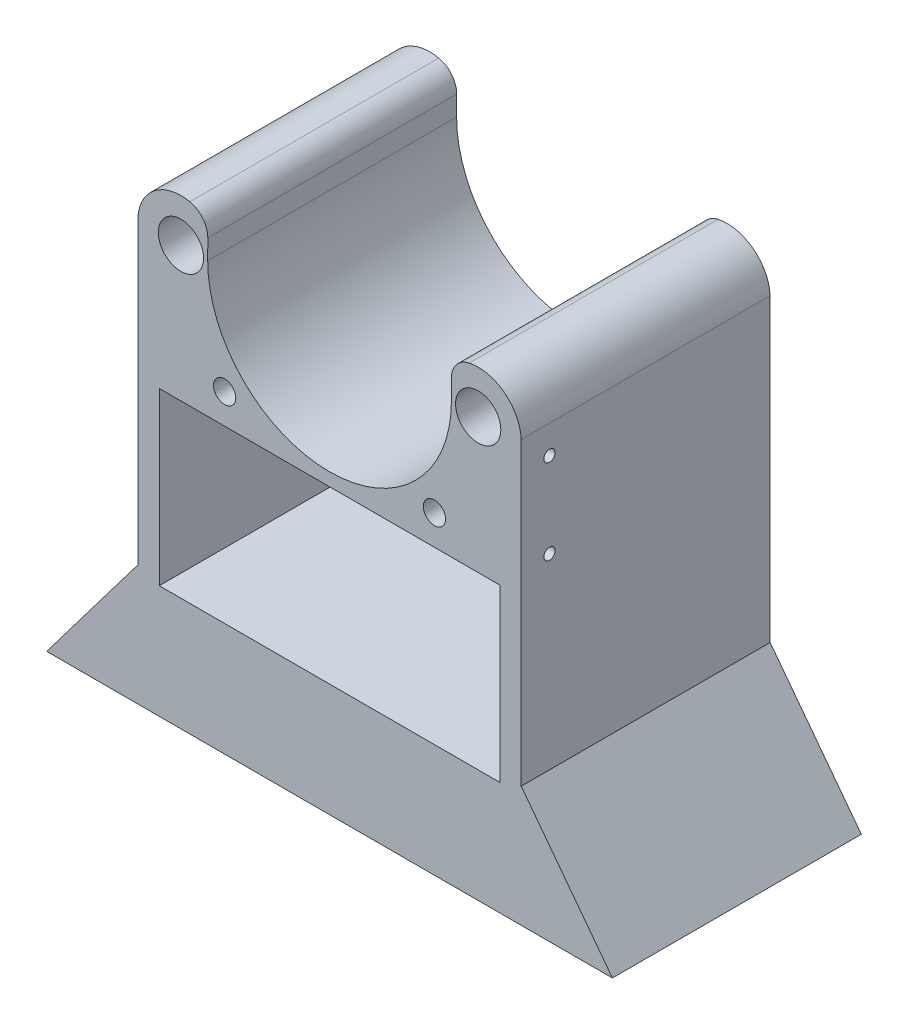
ISO-10303-21;
HEADER;
FILE_DESCRIPTION(('STEP AP214'),'2;1');
FILE_NAME('part.step','',(''),(''),'','','');
FILE_SCHEMA(('AUTOMOTIVE_DESIGN { 1 0 10303 214 1 1 1 1 }'));
ENDSEC;
DATA;
#1=APPLICATION_CONTEXT('core data for automotive mechanical design processes');
#2=APPLICATION_PROTOCOL_DEFINITION('international standard','automotive_design',2000,#1);
#3=PRODUCT_CONTEXT('',#1,'mechanical');
#4=PRODUCT('Part','Part','',(#3));
#5=PRODUCT_RELATED_PRODUCT_CATEGORY('part','',(#4));
#6=PRODUCT_DEFINITION_FORMATION('','',#4);
#7=PRODUCT_DEFINITION_CONTEXT('part definition',#1,'design');
#8=PRODUCT_DEFINITION('design','',#6,#7);
#9=PRODUCT_DEFINITION_SHAPE('','',#8);
#10=(LENGTH_UNIT() NAMED_UNIT(*) SI_UNIT(.MILLI.,.METRE.));
#11=(NAMED_UNIT(*) PLANE_ANGLE_UNIT() SI_UNIT($,.RADIAN.));
#12=(NAMED_UNIT(*) SI_UNIT($,.STERADIAN.) SOLID_ANGLE_UNIT());
#13=UNCERTAINTY_MEASURE_WITH_UNIT(LENGTH_MEASURE(1.E-05),#10,'distance_accuracy_value','');
#14=(GEOMETRIC_REPRESENTATION_CONTEXT(3) GLOBAL_UNCERTAINTY_ASSIGNED_CONTEXT((#13)) GLOBAL_UNIT_ASSIGNED_CONTEXT((#10,
#11,#12)) REPRESENTATION_CONTEXT('',''));
#15=CARTESIAN_POINT('',(0.,0.,0.));
#16=DIRECTION('',(0.,0.,1.));
#17=DIRECTION('',(1.,0.,0.));
#18=AXIS2_PLACEMENT_3D('',#15,#16,#17);
#19=CARTESIAN_POINT('',(43.029964919441,19.177,50.8));
#20=DIRECTION('',(-1.,0.,0.));
#21=DIRECTION('',(0.,0.,1.));
#22=AXIS2_PLACEMENT_3D('',#19,#20,#21);
#23=PLANE('',#22);
#24=CARTESIAN_POINT('',(43.029964919441,43.5410976898226,44.45));
#25=DIRECTION('',(-1.,0.,0.));
#26=DIRECTION('',(0.,0.,1.));
#27=AXIS2_PLACEMENT_3D('',#24,#25,#26);
#28=CIRCLE('',#27,1.27);
#29=CARTESIAN_POINT('',(43.029964919441,43.5410976898226,45.72));
#30=VERTEX_POINT('',#29);
#31=EDGE_CURVE('E755',#30,#30,#28,.T.);
#32=ORIENTED_EDGE('',*,*,#31,.T.);
#33=EDGE_LOOP('',(#32));
#34=FACE_BOUND('',#33,.T.);
#35=DIRECTION('',(0.,0.,-1.));
#36=VECTOR('',#35,1.);
#37=CARTESIAN_POINT('',(43.029964919441,-17.5223314583823,50.8));
#38=LINE('',#37,#36);
#39=CARTESIAN_POINT('',(43.029964919441,-17.5223314583823,50.8));
#40=VERTEX_POINT('',#39);
#41=CARTESIAN_POINT('',(43.029964919441,-17.5223314583823,-5.08));
#42=VERTEX_POINT('',#41);
#43=EDGE_CURVE('E167',#40,#42,#38,.T.);
#44=ORIENTED_EDGE('',*,*,#43,.T.);
#45=DIRECTION('',(0.,-1.,0.));
#46=VECTOR('',#45,1.);
#47=CARTESIAN_POINT('',(43.029964919441,49.8910976898227,-5.08));
#48=LINE('',#47,#46);
#49=CARTESIAN_POINT('',(43.029964919441,49.8910976898225,-5.08));
#50=VERTEX_POINT('',#49);
#51=EDGE_CURVE('E151',#50,#42,#48,.T.);
#52=ORIENTED_EDGE('',*,*,#51,.F.);
#53=DIRECTION('',(0.,0.,-1.));
#54=VECTOR('',#53,1.);
#55=CARTESIAN_POINT('',(43.029964919441,49.8910976898227,50.8));
#56=LINE('',#55,#54);
#57=CARTESIAN_POINT('',(43.029964919441,49.8910976898227,50.8));
#58=VERTEX_POINT('',#57);
#59=EDGE_CURVE('E161',#58,#50,#56,.T.);
#60=ORIENTED_EDGE('',*,*,#59,.F.);
#61=DIRECTION('',(0.,1.,0.));
#62=VECTOR('',#61,1.);
#63=CARTESIAN_POINT('',(43.029964919441,-17.5223314583823,50.8));
#64=LINE('',#63,#62);
#65=EDGE_CURVE('E227',#40,#58,#64,.T.);
#66=ORIENTED_EDGE('',*,*,#65,.F.);
#67=EDGE_LOOP('',(#44,#52,#60,#66));
#68=FACE_BOUND('',#67,.T.);
#69=CARTESIAN_POINT('',(43.029964919441,24.4910976898226,44.45));
#70=DIRECTION('',(-1.,0.,0.));
#71=DIRECTION('',(0.,0.,1.));
#72=AXIS2_PLACEMENT_3D('',#69,#70,#71);
#73=CIRCLE('',#72,1.27);
#74=CARTESIAN_POINT('',(43.029964919441,24.4910976898226,45.72));
#75=VERTEX_POINT('',#74);
#76=EDGE_CURVE('E753',#75,#75,#73,.T.);
#77=ORIENTED_EDGE('',*,*,#76,.T.);
#78=EDGE_LOOP('',(#77));
#79=FACE_BOUND('',#78,.T.);
#80=ADVANCED_FACE('F33',(#34,#68,#79),#23,.F.);
#81=CARTESIAN_POINT('',(33.3647511090705,49.8910976898227,-5.08));
#82=DIRECTION('',(0.,0.,1.));
#83=DIRECTION('',(1.,0.,0.));
#84=AXIS2_PLACEMENT_3D('',#81,#82,#83);
#85=PLANE('',#84);
#86=CARTESIAN_POINT('',(23.55,25.889500054,-5.08));
#87=DIRECTION('',(0.,0.,-1.));
#88=DIRECTION('',(-1.,0.,0.));
#89=AXIS2_PLACEMENT_3D('',#86,#87,#88);
#90=CIRCLE('',#89,2.5);
#91=CARTESIAN_POINT('',(21.05,25.889500054,-5.08));
#92=VERTEX_POINT('',#91);
#93=EDGE_CURVE('E178',#92,#92,#90,.T.);
#94=ORIENTED_EDGE('',*,*,#93,.F.);
#95=EDGE_LOOP('',(#94));
#96=FACE_BOUND('',#95,.T.);
#97=CARTESIAN_POINT('',(-23.55,25.889500054,-5.08));
#98=DIRECTION('',(0.,0.,-1.));
#99=DIRECTION('',(-1.,0.,0.));
#100=AXIS2_PLACEMENT_3D('',#97,#98,#99);
#101=CIRCLE('',#100,2.5);
#102=CARTESIAN_POINT('',(-26.05,25.889500054,-5.08));
#103=VERTEX_POINT('',#102);
#104=EDGE_CURVE('E319',#103,#103,#101,.T.);
#105=ORIENTED_EDGE('',*,*,#104,.F.);
#106=EDGE_LOOP('',(#105));
#107=FACE_BOUND('',#106,.T.);
#108=CARTESIAN_POINT('',(18.8760964149553,0.173903585044877,-5.08));
#109=DIRECTION('',(0.,0.,1.));
#110=DIRECTION('',(1.,0.,0.));
#111=AXIS2_PLACEMENT_3D('',#108,#109,#110);
#112=CIRCLE('',#111,3.3274);
#113=CARTESIAN_POINT('',(22.2034964149553,0.173903585044877,-5.08));
#114=VERTEX_POINT('',#113);
#115=EDGE_CURVE('E316',#114,#114,#112,.T.);
#116=ORIENTED_EDGE('',*,*,#115,.T.);
#117=EDGE_LOOP('',(#116));
#118=FACE_BOUND('',#117,.T.);
#119=CARTESIAN_POINT('',(-19.2239035850447,0.173903585044877,-5.08));
#120=DIRECTION('',(0.,0.,1.));
#121=DIRECTION('',(1.,0.,0.));
#122=AXIS2_PLACEMENT_3D('',#119,#120,#121);
#123=CIRCLE('',#122,3.3274);
#124=CARTESIAN_POINT('',(-15.8965035850447,0.173903585044877,-5.08));
#125=VERTEX_POINT('',#124);
#126=EDGE_CURVE('E310',#125,#125,#123,.T.);
#127=ORIENTED_EDGE('',*,*,#126,.T.);
#128=EDGE_LOOP('',(#127));
#129=FACE_BOUND('',#128,.T.);
#130=DIRECTION('',(-0.004485046887855,0.999989942126626,0.));
#131=VECTOR('',#130,1.);
#132=CARTESIAN_POINT('',(27.5715608985518,0.123660987167873,-5.07999999999997));
#133=LINE('',#132,#131);
#134=CARTESIAN_POINT('',(27.3503748233617,49.439500054,-5.07999999999997));
#135=VERTEX_POINT('',#134);
#136=CARTESIAN_POINT('',(27.3303126799442,53.9125729418832,-5.07999999999997));
#137=VERTEX_POINT('',#136);
#138=EDGE_CURVE('E262',#135,#137,#133,.T.);
#139=ORIENTED_EDGE('',*,*,#138,.T.);
#140=CARTESIAN_POINT('',(32.4102615859475,53.9353569800736,-5.08));
#141=DIRECTION('',(0.,0.,1.));
#142=DIRECTION('',(1.,0.,0.));
#143=AXIS2_PLACEMENT_3D('',#140,#141,#142);
#144=CIRCLE('',#143,5.08);
#145=CARTESIAN_POINT('',(31.3555354783079,58.9046580212526,-5.08));
#146=VERTEX_POINT('',#145);
#147=EDGE_CURVE('E153',#137,#146,#144,.F.);
#148=ORIENTED_EDGE('',*,*,#147,.T.);
#149=CARTESIAN_POINT('',(33.364499946,49.439500054,-5.08));
#150=DIRECTION('',(0.,0.,1.));
#151=DIRECTION('',(1.,0.,0.));
#152=AXIS2_PLACEMENT_3D('',#149,#150,#151);
#153=CIRCLE('',#152,9.67600917617876);
#154=EDGE_CURVE('E145',#146,#50,#153,.F.);
#155=ORIENTED_EDGE('',*,*,#154,.T.);
#156=ORIENTED_EDGE('',*,*,#51,.T.);
#157=DIRECTION('',(0.603372043697109,-0.797459827756091,0.));
#158=VECTOR('',#157,1.);
#159=CARTESIAN_POINT('',(43.029964919441,-17.5223314583823,-5.08));
#160=LINE('',#159,#158);
#161=CARTESIAN_POINT('',(63.5,-44.577,-5.08));
#162=VERTEX_POINT('',#161);
#163=EDGE_CURVE('E172',#42,#162,#160,.T.);
#164=ORIENTED_EDGE('',*,*,#163,.T.);
#165=DIRECTION('',(-1.,0.,0.));
#166=VECTOR('',#165,1.);
#167=CARTESIAN_POINT('',(63.5,-44.577,-5.08));
#168=LINE('',#167,#166);
#169=CARTESIAN_POINT('',(-63.5,-44.577,-5.08));
#170=VERTEX_POINT('',#169);
#171=EDGE_CURVE('E175',#162,#170,#168,.T.);
#172=ORIENTED_EDGE('',*,*,#171,.T.);
#173=DIRECTION('',(0.603372043697109,0.797459827756091,0.));
#174=VECTOR('',#173,1.);
#175=CARTESIAN_POINT('',(-63.5,-44.577,-5.08));
#176=LINE('',#175,#174);
#177=CARTESIAN_POINT('',(-43.029964919441,-17.5223314583823,-5.08));
#178=VERTEX_POINT('',#177);
#179=EDGE_CURVE('E184',#170,#178,#176,.T.);
#180=ORIENTED_EDGE('',*,*,#179,.T.);
#181=DIRECTION('',(0.,1.,0.));
#182=VECTOR('',#181,1.);
#183=CARTESIAN_POINT('',(-43.029964919441,-17.5223314583823,-5.08));
#184=LINE('',#183,#182);
#185=CARTESIAN_POINT('',(-43.029964919441,49.8910976898225,-5.08));
#186=VERTEX_POINT('',#185);
#187=EDGE_CURVE('E187',#178,#186,#184,.T.);
#188=ORIENTED_EDGE('',*,*,#187,.T.);
#189=CARTESIAN_POINT('',(-33.364499946,49.439500054,-5.08));
#190=DIRECTION('',(0.,0.,1.));
#191=DIRECTION('',(1.,0.,0.));
#192=AXIS2_PLACEMENT_3D('',#189,#190,#191);
#193=CIRCLE('',#192,9.67600917617876);
#194=CARTESIAN_POINT('',(-31.3555354783078,58.9046580212526,-5.08));
#195=VERTEX_POINT('',#194);
#196=EDGE_CURVE('E156',#195,#186,#193,.T.);
#197=ORIENTED_EDGE('',*,*,#196,.F.);
#198=CARTESIAN_POINT('',(-32.4102615859474,53.9353569800736,-5.08));
#199=DIRECTION('',(0.,0.,1.));
#200=DIRECTION('',(1.,0.,0.));
#201=AXIS2_PLACEMENT_3D('',#198,#199,#200);
#202=CIRCLE('',#201,5.08);
#203=CARTESIAN_POINT('',(-27.3303126799442,53.9125729418832,-5.07999999999997));
#204=VERTEX_POINT('',#203);
#205=EDGE_CURVE('E246',#195,#204,#202,.F.);
#206=ORIENTED_EDGE('',*,*,#205,.T.);
#207=DIRECTION('',(0.00448504688785946,0.999989942126626,0.));
#208=VECTOR('',#207,1.);
#209=CARTESIAN_POINT('',(-27.5715608985521,0.123660987167984,-5.07999999999997));
#210=LINE('',#209,#208);
#211=CARTESIAN_POINT('',(-27.3503748233617,49.439500054,-5.07999999999997));
#212=VERTEX_POINT('',#211);
#213=EDGE_CURVE('E269',#212,#204,#210,.T.);
#214=ORIENTED_EDGE('',*,*,#213,.F.);
#215=CARTESIAN_POINT('',(0.,49.439500054,-5.07999999999997));
#216=DIRECTION('',(0.,0.,-1.));
#217=DIRECTION('',(-1.,0.,0.));
#218=AXIS2_PLACEMENT_3D('',#215,#216,#217);
#219=CIRCLE('',#218,27.3503748233617);
#220=EDGE_CURVE('E264',#135,#212,#219,.T.);
#221=ORIENTED_EDGE('',*,*,#220,.F.);
#222=EDGE_LOOP('',(#139,#148,#155,#156,#164,#172,#180,#188,#197,#206,#214,#221));
#223=FACE_BOUND('',#222,.T.);
#224=ADVANCED_FACE('F148',(#96,#107,#118,#129,#223),#85,.F.);
#225=CARTESIAN_POINT('',(-27.5715608985521,0.123660987167984,55.118));
#226=DIRECTION('',(-0.999989942126626,0.00448504688785946,0.));
#227=DIRECTION('',(-0.00448504688785946,-0.999989942126626,0.));
#228=AXIS2_PLACEMENT_3D('',#225,#226,#227);
#229=PLANE('',#228);
#230=ORIENTED_EDGE('',*,*,#213,.T.);
#231=DIRECTION('',(0.,0.,-1.));
#232=VECTOR('',#231,1.);
#233=CARTESIAN_POINT('',(-27.3303126799442,53.9125729418832,55.118));
#234=LINE('',#233,#232);
#235=CARTESIAN_POINT('',(-27.3303126799442,53.9125729418832,50.8));
#236=VERTEX_POINT('',#235);
#237=EDGE_CURVE('E11',#204,#236,#234,.F.);
#238=ORIENTED_EDGE('',*,*,#237,.T.);
#239=DIRECTION('',(-0.00448504688785946,-0.999989942126626,0.));
#240=VECTOR('',#239,1.);
#241=CARTESIAN_POINT('',(-27.349153504459,49.7118063752811,50.8));
#242=LINE('',#241,#240);
#243=CARTESIAN_POINT('',(-27.3503748233617,49.439500054,50.8));
#244=VERTEX_POINT('',#243);
#245=EDGE_CURVE('E275',#236,#244,#242,.T.);
#246=ORIENTED_EDGE('',*,*,#245,.T.);
#247=DIRECTION('',(0.,0.,-1.));
#248=VECTOR('',#247,1.);
#249=CARTESIAN_POINT('',(-27.3503748233617,49.439500054,55.118));
#250=LINE('',#249,#248);
#251=EDGE_CURVE('E272',#244,#212,#250,.T.);
#252=ORIENTED_EDGE('',*,*,#251,.T.);
#253=EDGE_LOOP('',(#230,#238,#246,#252));
#254=FACE_BOUND('',#253,.T.);
#255=ADVANCED_FACE('F331',(#254),#229,.F.);
#256=CARTESIAN_POINT('',(33.364499946,49.439500054,50.8));
#257=DIRECTION('',(0.,0.,-1.));
#258=DIRECTION('',(-1.,0.,0.));
#259=AXIS2_PLACEMENT_3D('',#256,#257,#258);
#260=CYLINDRICAL_SURFACE('',#259,9.67600917617876);
#261=ORIENTED_EDGE('',*,*,#154,.F.);
#262=DIRECTION('',(0.,0.,-1.));
#263=VECTOR('',#262,1.);
#264=CARTESIAN_POINT('',(31.3555354783079,58.9046580212526,50.8));
#265=LINE('',#264,#263);
#266=CARTESIAN_POINT('',(31.3555354783079,58.9046580212526,50.8));
#267=VERTEX_POINT('',#266);
#268=EDGE_CURVE('E249',#146,#267,#265,.F.);
#269=ORIENTED_EDGE('',*,*,#268,.T.);
#270=CARTESIAN_POINT('',(33.364499946,49.439500054,50.8));
#271=DIRECTION('',(0.,0.,1.));
#272=DIRECTION('',(1.,0.,0.));
#273=AXIS2_PLACEMENT_3D('',#270,#271,#272);
#274=CIRCLE('',#273,9.67600917617876);
#275=EDGE_CURVE('E164',#58,#267,#274,.T.);
#276=ORIENTED_EDGE('',*,*,#275,.F.);
#277=ORIENTED_EDGE('',*,*,#59,.T.);
#278=EDGE_LOOP('',(#261,#269,#276,#277));
#279=FACE_BOUND('',#278,.T.);
#280=ADVANCED_FACE('F162',(#279),#260,.T.);
#281=CARTESIAN_POINT('',(33.364499946,49.439500054,50.8));
#282=DIRECTION('',(0.,0.,1.));
#283=DIRECTION('',(1.,0.,0.));
#284=AXIS2_PLACEMENT_3D('',#281,#282,#283);
#285=PLANE('',#284);
#286=ORIENTED_EDGE('',*,*,#275,.T.);
#287=CARTESIAN_POINT('',(32.4102615859475,53.9353569800736,50.8));
#288=DIRECTION('',(0.,0.,1.));
#289=DIRECTION('',(1.,0.,0.));
#290=AXIS2_PLACEMENT_3D('',#287,#288,#289);
#291=CIRCLE('',#290,5.08);
#292=CARTESIAN_POINT('',(27.3303126799442,53.9125729418833,50.8));
#293=VERTEX_POINT('',#292);
#294=EDGE_CURVE('E252',#267,#293,#291,.T.);
#295=ORIENTED_EDGE('',*,*,#294,.T.);
#296=DIRECTION('',(0.004485046887855,-0.999989942126627,0.));
#297=VECTOR('',#296,1.);
#298=CARTESIAN_POINT('',(27.3504958013711,49.4125266921329,50.8));
#299=LINE('',#298,#297);
#300=CARTESIAN_POINT('',(27.3503748233617,49.439500054,50.8));
#301=VERTEX_POINT('',#300);
#302=EDGE_CURVE('E278',#293,#301,#299,.T.);
#303=ORIENTED_EDGE('',*,*,#302,.T.);
#304=CARTESIAN_POINT('',(0.,49.439500054,50.8));
#305=DIRECTION('',(0.,0.,1.));
#306=DIRECTION('',(1.,0.,0.));
#307=AXIS2_PLACEMENT_3D('',#304,#305,#306);
#308=CIRCLE('',#307,27.3503748233617);
#309=EDGE_CURVE('E280',#244,#301,#308,.T.);
#310=ORIENTED_EDGE('',*,*,#309,.F.);
#311=ORIENTED_EDGE('',*,*,#245,.F.);
#312=CARTESIAN_POINT('',(-32.4102615859474,53.9353569800736,50.8));
#313=DIRECTION('',(0.,0.,1.));
#314=DIRECTION('',(1.,0.,0.));
#315=AXIS2_PLACEMENT_3D('',#312,#313,#314);
#316=CIRCLE('',#315,5.08);
#317=CARTESIAN_POINT('',(-31.3555354783078,58.9046580212526,50.8));
#318=VERTEX_POINT('',#317);
#319=EDGE_CURVE('E48',#236,#318,#316,.T.);
#320=ORIENTED_EDGE('',*,*,#319,.T.);
#321=CARTESIAN_POINT('',(-33.364499946,49.439500054,50.8));
#322=DIRECTION('',(0.,0.,1.));
#323=DIRECTION('',(-1.,0.,0.));
#324=AXIS2_PLACEMENT_3D('',#321,#322,#323);
#325=CIRCLE('',#324,9.67600917617876);
#326=CARTESIAN_POINT('',(-43.029964919441,49.8910976898227,50.8));
#327=VERTEX_POINT('',#326);
#328=EDGE_CURVE('E230',#318,#327,#325,.T.);
#329=ORIENTED_EDGE('',*,*,#328,.T.);
#330=DIRECTION('',(0.,-1.,0.));
#331=VECTOR('',#330,1.);
#332=CARTESIAN_POINT('',(-43.029964919441,19.177,50.8));
#333=LINE('',#332,#331);
#334=CARTESIAN_POINT('',(-43.029964919441,-17.5223314583823,50.8));
#335=VERTEX_POINT('',#334);
#336=EDGE_CURVE('E232',#327,#335,#333,.T.);
#337=ORIENTED_EDGE('',*,*,#336,.T.);
#338=DIRECTION('',(-0.603372043697109,-0.797459827756091,0.));
#339=VECTOR('',#338,1.);
#340=CARTESIAN_POINT('',(-43.029964919441,-17.5223314583823,50.8));
#341=LINE('',#340,#339);
#342=CARTESIAN_POINT('',(-63.5,-44.577,50.8));
#343=VERTEX_POINT('',#342);
#344=EDGE_CURVE('E220',#335,#343,#341,.T.);
#345=ORIENTED_EDGE('',*,*,#344,.T.);
#346=DIRECTION('',(1.,0.,0.));
#347=VECTOR('',#346,1.);
#348=CARTESIAN_POINT('',(-63.5,-44.577,50.8));
#349=LINE('',#348,#347);
#350=CARTESIAN_POINT('',(63.5,-44.577,50.8));
#351=VERTEX_POINT('',#350);
#352=EDGE_CURVE('E223',#343,#351,#349,.T.);
#353=ORIENTED_EDGE('',*,*,#352,.T.);
#354=DIRECTION('',(-0.603372043697109,0.797459827756091,0.));
#355=VECTOR('',#354,1.);
#356=CARTESIAN_POINT('',(43.029964919441,-17.5223314583823,50.8));
#357=LINE('',#356,#355);
#358=EDGE_CURVE('E225',#351,#40,#357,.T.);
#359=ORIENTED_EDGE('',*,*,#358,.T.);
#360=ORIENTED_EDGE('',*,*,#65,.T.);
#361=EDGE_LOOP('',(#286,#295,#303,#310,#311,#320,#329,#337,#345,#353,#359,#360));
#362=FACE_BOUND('',#361,.T.);
#363=CARTESIAN_POINT('',(33.364499946,49.439500054,50.8));
#364=DIRECTION('',(0.,0.,1.));
#365=DIRECTION('',(1.,0.,0.));
#366=AXIS2_PLACEMENT_3D('',#363,#364,#365);
#367=CIRCLE('',#366,5.08);
#368=CARTESIAN_POINT('',(38.444499946,49.439500054,50.8));
#369=VERTEX_POINT('',#368);
#370=EDGE_CURVE('E293',#369,#369,#367,.T.);
#371=ORIENTED_EDGE('',*,*,#370,.F.);
#372=EDGE_LOOP('',(#371));
#373=FACE_BOUND('',#372,.T.);
#374=CARTESIAN_POINT('',(-33.3644999459999,49.4395000540001,50.8));
#375=DIRECTION('',(0.,0.,1.));
#376=DIRECTION('',(1.,0.,0.));
#377=AXIS2_PLACEMENT_3D('',#374,#375,#376);
#378=CIRCLE('',#377,5.08);
#379=CARTESIAN_POINT('',(-28.2844999459999,49.4395000540001,50.8));
#380=VERTEX_POINT('',#379);
#381=EDGE_CURVE('E301',#380,#380,#378,.T.);
#382=ORIENTED_EDGE('',*,*,#381,.F.);
#383=EDGE_LOOP('',(#382));
#384=FACE_BOUND('',#383,.T.);
#385=CARTESIAN_POINT('',(-23.55,25.889500054,50.8));
#386=DIRECTION('',(0.,0.,1.));
#387=DIRECTION('',(1.,0.,0.));
#388=AXIS2_PLACEMENT_3D('',#385,#386,#387);
#389=CIRCLE('',#388,2.5);
#390=CARTESIAN_POINT('',(-21.05,25.889500054,50.8));
#391=VERTEX_POINT('',#390);
#392=EDGE_CURVE('E322',#391,#391,#389,.T.);
#393=ORIENTED_EDGE('',*,*,#392,.F.);
#394=EDGE_LOOP('',(#393));
#395=FACE_BOUND('',#394,.T.);
#396=CARTESIAN_POINT('',(23.55,25.889500054,50.8));
#397=DIRECTION('',(0.,0.,1.));
#398=DIRECTION('',(1.,0.,0.));
#399=AXIS2_PLACEMENT_3D('',#396,#397,#398);
#400=CIRCLE('',#399,2.5);
#401=CARTESIAN_POINT('',(26.05,25.889500054,50.8));
#402=VERTEX_POINT('',#401);
#403=EDGE_CURVE('E173',#402,#402,#400,.T.);
#404=ORIENTED_EDGE('',*,*,#403,.F.);
#405=EDGE_LOOP('',(#404));
#406=FACE_BOUND('',#405,.T.);
#407=DIRECTION('',(-1.,0.,0.));
#408=VECTOR('',#407,1.);
#409=CARTESIAN_POINT('',(-38.227,19.177,50.8));
#410=LINE('',#409,#408);
#411=CARTESIAN_POINT('',(38.227,19.177,50.8));
#412=VERTEX_POINT('',#411);
#413=CARTESIAN_POINT('',(-38.227,19.177,50.8));
#414=VERTEX_POINT('',#413);
#415=EDGE_CURVE('E193',#412,#414,#410,.T.);
#416=ORIENTED_EDGE('',*,*,#415,.F.);
#417=DIRECTION('',(0.,1.,0.));
#418=VECTOR('',#417,1.);
#419=CARTESIAN_POINT('',(38.227,-19.177,50.8));
#420=LINE('',#419,#418);
#421=CARTESIAN_POINT('',(38.227,-19.177,50.8));
#422=VERTEX_POINT('',#421);
#423=EDGE_CURVE('E191',#422,#412,#420,.T.);
#424=ORIENTED_EDGE('',*,*,#423,.F.);
#425=DIRECTION('',(1.,0.,0.));
#426=VECTOR('',#425,1.);
#427=CARTESIAN_POINT('',(-38.227,-19.177,50.8));
#428=LINE('',#427,#426);
#429=CARTESIAN_POINT('',(-38.227,-19.177,50.8));
#430=VERTEX_POINT('',#429);
#431=EDGE_CURVE('E199',#430,#422,#428,.T.);
#432=ORIENTED_EDGE('',*,*,#431,.F.);
#433=DIRECTION('',(0.,-1.,0.));
#434=VECTOR('',#433,1.);
#435=CARTESIAN_POINT('',(-38.227,-19.177,50.8));
#436=LINE('',#435,#434);
#437=EDGE_CURVE('E196',#414,#430,#436,.T.);
#438=ORIENTED_EDGE('',*,*,#437,.F.);
#439=EDGE_LOOP('',(#416,#424,#432,#438));
#440=FACE_BOUND('',#439,.T.);
#441=ADVANCED_FACE('F376',(#362,#373,#384,#395,#406,#440),#285,.T.);
#442=CARTESIAN_POINT('',(-43.029964919441,-17.5223314583823,50.8));
#443=DIRECTION('',(0.797459827756091,-0.603372043697109,0.));
#444=DIRECTION('',(0.603372043697109,0.797459827756091,0.));
#445=AXIS2_PLACEMENT_3D('',#442,#443,#444);
#446=PLANE('',#445);
#447=DIRECTION('',(0.,0.,-1.));
#448=VECTOR('',#447,1.);
#449=CARTESIAN_POINT('',(-43.029964919441,-17.5223314583823,50.8));
#450=LINE('',#449,#448);
#451=EDGE_CURVE('E234',#335,#178,#450,.T.);
#452=ORIENTED_EDGE('',*,*,#451,.T.);
#453=ORIENTED_EDGE('',*,*,#179,.F.);
#454=DIRECTION('',(0.,0.,-1.));
#455=VECTOR('',#454,1.);
#456=CARTESIAN_POINT('',(-63.5,-44.577,50.8));
#457=LINE('',#456,#455);
#458=EDGE_CURVE('E241',#343,#170,#457,.T.);
#459=ORIENTED_EDGE('',*,*,#458,.F.);
#460=ORIENTED_EDGE('',*,*,#344,.F.);
#461=EDGE_LOOP('',(#452,#453,#459,#460));
#462=FACE_BOUND('',#461,.T.);
#463=ADVANCED_FACE('F373',(#462),#446,.F.);
#464=CARTESIAN_POINT('',(-63.5,-44.577,50.8));
#465=DIRECTION('',(0.,1.,0.));
#466=DIRECTION('',(0.,0.,1.));
#467=AXIS2_PLACEMENT_3D('',#464,#465,#466);
#468=PLANE('',#467);
#469=ORIENTED_EDGE('',*,*,#458,.T.);
#470=ORIENTED_EDGE('',*,*,#171,.F.);
#471=DIRECTION('',(0.,0.,-1.));
#472=VECTOR('',#471,1.);
#473=CARTESIAN_POINT('',(63.5,-44.577,50.8));
#474=LINE('',#473,#472);
#475=EDGE_CURVE('E239',#351,#162,#474,.T.);
#476=ORIENTED_EDGE('',*,*,#475,.F.);
#477=ORIENTED_EDGE('',*,*,#352,.F.);
#478=EDGE_LOOP('',(#469,#470,#476,#477));
#479=FACE_BOUND('',#478,.T.);
#480=ADVANCED_FACE('F369',(#479),#468,.F.);
#481=CARTESIAN_POINT('',(43.029964919441,-17.5223314583823,50.8));
#482=DIRECTION('',(-0.797459827756091,-0.603372043697109,0.));
#483=DIRECTION('',(0.603372043697109,-0.797459827756091,0.));
#484=AXIS2_PLACEMENT_3D('',#481,#482,#483);
#485=PLANE('',#484);
#486=ORIENTED_EDGE('',*,*,#475,.T.);
#487=ORIENTED_EDGE('',*,*,#163,.F.);
#488=ORIENTED_EDGE('',*,*,#43,.F.);
#489=ORIENTED_EDGE('',*,*,#358,.F.);
#490=EDGE_LOOP('',(#486,#487,#488,#489));
#491=FACE_BOUND('',#490,.T.);
#492=ADVANCED_FACE('F366',(#491),#485,.F.);
#493=CARTESIAN_POINT('',(-33.364499946,49.439500054,50.8));
#494=DIRECTION('',(0.,0.,-1.));
#495=DIRECTION('',(-1.,0.,0.));
#496=AXIS2_PLACEMENT_3D('',#493,#494,#495);
#497=CYLINDRICAL_SURFACE('',#496,9.67600917617876);
#498=ORIENTED_EDGE('',*,*,#328,.F.);
#499=DIRECTION('',(0.,0.,-1.));
#500=VECTOR('',#499,1.);
#501=CARTESIAN_POINT('',(-31.3555354783078,58.9046580212526,50.8));
#502=LINE('',#501,#500);
#503=EDGE_CURVE('E41',#318,#195,#502,.T.);
#504=ORIENTED_EDGE('',*,*,#503,.T.);
#505=ORIENTED_EDGE('',*,*,#196,.T.);
#506=DIRECTION('',(0.,0.,-1.));
#507=VECTOR('',#506,1.);
#508=CARTESIAN_POINT('',(-43.029964919441,49.8910976898227,50.8));
#509=LINE('',#508,#507);
#510=EDGE_CURVE('E168',#327,#186,#509,.T.);
#511=ORIENTED_EDGE('',*,*,#510,.F.);
#512=EDGE_LOOP('',(#498,#504,#505,#511));
#513=FACE_BOUND('',#512,.T.);
#514=ADVANCED_FACE('F257',(#513),#497,.T.);
#515=CARTESIAN_POINT('',(-43.029964919441,-17.5223314583823,50.8));
#516=DIRECTION('',(1.,0.,0.));
#517=DIRECTION('',(0.,0.,-1.));
#518=AXIS2_PLACEMENT_3D('',#515,#516,#517);
#519=PLANE('',#518);
#520=CARTESIAN_POINT('',(-43.029964919441,24.4910976898226,44.45));
#521=DIRECTION('',(-1.,0.,0.));
#522=DIRECTION('',(0.,0.,1.));
#523=AXIS2_PLACEMENT_3D('',#520,#521,#522);
#524=CIRCLE('',#523,1.27);
#525=CARTESIAN_POINT('',(-43.029964919441,24.4910976898226,45.72));
#526=VERTEX_POINT('',#525);
#527=EDGE_CURVE('E283',#526,#526,#524,.T.);
#528=ORIENTED_EDGE('',*,*,#527,.F.);
#529=EDGE_LOOP('',(#528));
#530=FACE_BOUND('',#529,.T.);
#531=CARTESIAN_POINT('',(-43.029964919441,43.5410976898226,44.45));
#532=DIRECTION('',(-1.,0.,0.));
#533=DIRECTION('',(0.,0.,1.));
#534=AXIS2_PLACEMENT_3D('',#531,#532,#533);
#535=CIRCLE('',#534,1.27);
#536=CARTESIAN_POINT('',(-43.029964919441,43.5410976898226,45.72));
#537=VERTEX_POINT('',#536);
#538=EDGE_CURVE('E287',#537,#537,#535,.T.);
#539=ORIENTED_EDGE('',*,*,#538,.F.);
#540=EDGE_LOOP('',(#539));
#541=FACE_BOUND('',#540,.T.);
#542=ORIENTED_EDGE('',*,*,#510,.T.);
#543=ORIENTED_EDGE('',*,*,#187,.F.);
#544=ORIENTED_EDGE('',*,*,#451,.F.);
#545=ORIENTED_EDGE('',*,*,#336,.F.);
#546=EDGE_LOOP('',(#542,#543,#544,#545));
#547=FACE_BOUND('',#546,.T.);
#548=ADVANCED_FACE('F486',(#530,#541,#547),#519,.F.);
#549=CARTESIAN_POINT('',(38.227,-19.177,50.8));
#550=DIRECTION('',(-1.,0.,0.));
#551=DIRECTION('',(0.,0.,1.));
#552=AXIS2_PLACEMENT_3D('',#549,#550,#551);
#553=PLANE('',#552);
#554=DIRECTION('',(0.,1.,0.));
#555=VECTOR('',#554,1.);
#556=CARTESIAN_POINT('',(38.227,-19.177,0.));
#557=LINE('',#556,#555);
#558=CARTESIAN_POINT('',(38.227,-19.177,0.));
#559=VERTEX_POINT('',#558);
#560=CARTESIAN_POINT('',(38.227,19.177,0.));
#561=VERTEX_POINT('',#560);
#562=EDGE_CURVE('E190',#559,#561,#557,.T.);
#563=ORIENTED_EDGE('',*,*,#562,.F.);
#564=DIRECTION('',(0.,0.,-1.));
#565=VECTOR('',#564,1.);
#566=CARTESIAN_POINT('',(38.227,-19.177,50.8));
#567=LINE('',#566,#565);
#568=EDGE_CURVE('E201',#422,#559,#567,.T.);
#569=ORIENTED_EDGE('',*,*,#568,.F.);
#570=ORIENTED_EDGE('',*,*,#423,.T.);
#571=DIRECTION('',(0.,0.,-1.));
#572=VECTOR('',#571,1.);
#573=CARTESIAN_POINT('',(38.227,19.177,50.8));
#574=LINE('',#573,#572);
#575=EDGE_CURVE('E217',#412,#561,#574,.T.);
#576=ORIENTED_EDGE('',*,*,#575,.T.);
#577=EDGE_LOOP('',(#563,#569,#570,#576));
#578=FACE_BOUND('',#577,.T.);
#579=ADVANCED_FACE('F470',(#578),#553,.T.);
#580=CARTESIAN_POINT('',(-38.227,19.177,50.8));
#581=DIRECTION('',(0.,-1.,0.));
#582=DIRECTION('',(0.,0.,-1.));
#583=AXIS2_PLACEMENT_3D('',#580,#581,#582);
#584=PLANE('',#583);
#585=DIRECTION('',(-1.,0.,0.));
#586=VECTOR('',#585,1.);
#587=CARTESIAN_POINT('',(-38.227,19.177,0.));
#588=LINE('',#587,#586);
#589=CARTESIAN_POINT('',(-38.227,19.177,0.));
#590=VERTEX_POINT('',#589);
#591=EDGE_CURVE('E204',#561,#590,#588,.T.);
#592=ORIENTED_EDGE('',*,*,#591,.F.);
#593=ORIENTED_EDGE('',*,*,#575,.F.);
#594=ORIENTED_EDGE('',*,*,#415,.T.);
#595=DIRECTION('',(0.,0.,-1.));
#596=VECTOR('',#595,1.);
#597=CARTESIAN_POINT('',(-38.227,19.177,50.8));
#598=LINE('',#597,#596);
#599=EDGE_CURVE('E215',#414,#590,#598,.T.);
#600=ORIENTED_EDGE('',*,*,#599,.T.);
#601=EDGE_LOOP('',(#592,#593,#594,#600));
#602=FACE_BOUND('',#601,.T.);
#603=ADVANCED_FACE('F462',(#602),#584,.T.);
#604=CARTESIAN_POINT('',(-38.227,-19.177,50.8));
#605=DIRECTION('',(1.,0.,0.));
#606=DIRECTION('',(0.,0.,-1.));
#607=AXIS2_PLACEMENT_3D('',#604,#605,#606);
#608=PLANE('',#607);
#609=DIRECTION('',(0.,-1.,0.));
#610=VECTOR('',#609,1.);
#611=CARTESIAN_POINT('',(-38.227,-19.177,0.));
#612=LINE('',#611,#610);
#613=CARTESIAN_POINT('',(-38.227,-19.177,0.));
#614=VERTEX_POINT('',#613);
#615=EDGE_CURVE('E207',#590,#614,#612,.T.);
#616=ORIENTED_EDGE('',*,*,#615,.F.);
#617=ORIENTED_EDGE('',*,*,#599,.F.);
#618=ORIENTED_EDGE('',*,*,#437,.T.);
#619=DIRECTION('',(0.,0.,-1.));
#620=VECTOR('',#619,1.);
#621=CARTESIAN_POINT('',(-38.227,-19.177,50.8));
#622=LINE('',#621,#620);
#623=EDGE_CURVE('E213',#430,#614,#622,.T.);
#624=ORIENTED_EDGE('',*,*,#623,.T.);
#625=EDGE_LOOP('',(#616,#617,#618,#624));
#626=FACE_BOUND('',#625,.T.);
#627=ADVANCED_FACE('F465',(#626),#608,.T.);
#628=CARTESIAN_POINT('',(-38.227,-19.177,50.8));
#629=DIRECTION('',(0.,1.,0.));
#630=DIRECTION('',(0.,0.,1.));
#631=AXIS2_PLACEMENT_3D('',#628,#629,#630);
#632=PLANE('',#631);
#633=DIRECTION('',(1.,0.,0.));
#634=VECTOR('',#633,1.);
#635=CARTESIAN_POINT('',(-38.227,-19.177,0.));
#636=LINE('',#635,#634);
#637=EDGE_CURVE('E194',#614,#559,#636,.T.);
#638=ORIENTED_EDGE('',*,*,#637,.F.);
#639=ORIENTED_EDGE('',*,*,#623,.F.);
#640=ORIENTED_EDGE('',*,*,#431,.T.);
#641=ORIENTED_EDGE('',*,*,#568,.T.);
#642=EDGE_LOOP('',(#638,#639,#640,#641));
#643=FACE_BOUND('',#642,.T.);
#644=ADVANCED_FACE('F473',(#643),#632,.T.);
#645=CARTESIAN_POINT('',(33.3647511090705,49.8910976898227,0.));
#646=DIRECTION('',(0.,0.,1.));
#647=DIRECTION('',(1.,0.,0.));
#648=AXIS2_PLACEMENT_3D('',#645,#646,#647);
#649=PLANE('',#648);
#650=CARTESIAN_POINT('',(-19.2239035850447,0.173903585044877,0.));
#651=DIRECTION('',(0.,0.,1.));
#652=DIRECTION('',(1.,0.,0.));
#653=AXIS2_PLACEMENT_3D('',#650,#651,#652);
#654=CIRCLE('',#653,3.3274);
#655=CARTESIAN_POINT('',(-15.8965035850447,0.173903585044877,0.));
#656=VERTEX_POINT('',#655);
#657=EDGE_CURVE('E307',#656,#656,#654,.T.);
#658=ORIENTED_EDGE('',*,*,#657,.F.);
#659=EDGE_LOOP('',(#658));
#660=FACE_BOUND('',#659,.T.);
#661=CARTESIAN_POINT('',(18.8760964149553,0.173903585044877,0.));
#662=DIRECTION('',(0.,0.,1.));
#663=DIRECTION('',(1.,0.,0.));
#664=AXIS2_PLACEMENT_3D('',#661,#662,#663);
#665=CIRCLE('',#664,3.3274);
#666=CARTESIAN_POINT('',(22.2034964149553,0.173903585044877,0.));
#667=VERTEX_POINT('',#666);
#668=EDGE_CURVE('E313',#667,#667,#665,.T.);
#669=ORIENTED_EDGE('',*,*,#668,.F.);
#670=EDGE_LOOP('',(#669));
#671=FACE_BOUND('',#670,.T.);
#672=ORIENTED_EDGE('',*,*,#637,.T.);
#673=ORIENTED_EDGE('',*,*,#562,.T.);
#674=ORIENTED_EDGE('',*,*,#591,.T.);
#675=ORIENTED_EDGE('',*,*,#615,.T.);
#676=EDGE_LOOP('',(#672,#673,#674,#675));
#677=FACE_BOUND('',#676,.T.);
#678=ADVANCED_FACE('F441',(#660,#671,#677),#649,.T.);
#679=CARTESIAN_POINT('',(23.55,25.889500054,152.654));
#680=DIRECTION('',(0.,0.,-1.));
#681=DIRECTION('',(-1.,0.,0.));
#682=AXIS2_PLACEMENT_3D('',#679,#680,#681);
#683=CYLINDRICAL_SURFACE('',#682,2.5);
#684=ORIENTED_EDGE('',*,*,#403,.T.);
#685=EDGE_LOOP('',(#684));
#686=FACE_BOUND('',#685,.T.);
#687=ORIENTED_EDGE('',*,*,#93,.T.);
#688=EDGE_LOOP('',(#687));
#689=FACE_BOUND('',#688,.T.);
#690=ADVANCED_FACE('F327',(#686,#689),#683,.F.);
#691=CARTESIAN_POINT('',(-23.55,25.889500054,152.654));
#692=DIRECTION('',(0.,0.,-1.));
#693=DIRECTION('',(-1.,0.,0.));
#694=AXIS2_PLACEMENT_3D('',#691,#692,#693);
#695=CYLINDRICAL_SURFACE('',#694,2.5);
#696=ORIENTED_EDGE('',*,*,#392,.T.);
#697=EDGE_LOOP('',(#696));
#698=FACE_BOUND('',#697,.T.);
#699=ORIENTED_EDGE('',*,*,#104,.T.);
#700=EDGE_LOOP('',(#699));
#701=FACE_BOUND('',#700,.T.);
#702=ADVANCED_FACE('F352',(#698,#701),#695,.F.);
#703=CARTESIAN_POINT('',(18.8760964149553,0.173903585044877,-50.8));
#704=DIRECTION('',(0.,0.,1.));
#705=DIRECTION('',(1.,0.,0.));
#706=AXIS2_PLACEMENT_3D('',#703,#704,#705);
#707=CYLINDRICAL_SURFACE('',#706,3.3274);
#708=ORIENTED_EDGE('',*,*,#668,.T.);
#709=EDGE_LOOP('',(#708));
#710=FACE_BOUND('',#709,.T.);
#711=ORIENTED_EDGE('',*,*,#115,.F.);
#712=EDGE_LOOP('',(#711));
#713=FACE_BOUND('',#712,.T.);
#714=ADVANCED_FACE('F342',(#710,#713),#707,.F.);
#715=CARTESIAN_POINT('',(-19.2239035850447,0.173903585044877,-50.8));
#716=DIRECTION('',(0.,0.,1.));
#717=DIRECTION('',(1.,0.,0.));
#718=AXIS2_PLACEMENT_3D('',#715,#716,#717);
#719=CYLINDRICAL_SURFACE('',#718,3.3274);
#720=ORIENTED_EDGE('',*,*,#657,.T.);
#721=EDGE_LOOP('',(#720));
#722=FACE_BOUND('',#721,.T.);
#723=ORIENTED_EDGE('',*,*,#126,.F.);
#724=EDGE_LOOP('',(#723));
#725=FACE_BOUND('',#724,.T.);
#726=ADVANCED_FACE('F339',(#722,#725),#719,.F.);
#727=CARTESIAN_POINT('',(-33.3644999459999,49.4395000540001,-14.3684097937107));
#728=DIRECTION('',(0.,0.,1.));
#729=DIRECTION('',(1.,0.,0.));
#730=AXIS2_PLACEMENT_3D('',#727,#728,#729);
#731=CYLINDRICAL_SURFACE('',#730,5.08);
#732=CARTESIAN_POINT('',(-33.3644999459999,49.4395000540001,0.));
#733=DIRECTION('',(0.,0.,1.));
#734=DIRECTION('',(1.,0.,0.));
#735=AXIS2_PLACEMENT_3D('',#732,#733,#734);
#736=CIRCLE('',#735,5.08);
#737=CARTESIAN_POINT('',(-28.2844999459999,49.4395000540001,0.));
#738=VERTEX_POINT('',#737);
#739=EDGE_CURVE('E304',#738,#738,#736,.F.);
#740=ORIENTED_EDGE('',*,*,#739,.T.);
#741=EDGE_LOOP('',(#740));
#742=FACE_BOUND('',#741,.T.);
#743=ORIENTED_EDGE('',*,*,#381,.T.);
#744=EDGE_LOOP('',(#743));
#745=FACE_BOUND('',#744,.T.);
#746=ADVANCED_FACE('F341',(#742,#745),#731,.F.);
#747=ORIENTED_EDGE('',*,*,#739,.F.);
#748=EDGE_LOOP('',(#747));
#749=FACE_BOUND('',#748,.T.);
#750=ADVANCED_FACE('F349',(#749),#649,.T.);
#751=CARTESIAN_POINT('',(33.364499946,49.439500054,-14.3684097937107));
#752=DIRECTION('',(0.,0.,1.));
#753=DIRECTION('',(1.,0.,0.));
#754=AXIS2_PLACEMENT_3D('',#751,#752,#753);
#755=CYLINDRICAL_SURFACE('',#754,5.08);
#756=CARTESIAN_POINT('',(33.364499946,49.439500054,0.));
#757=DIRECTION('',(0.,0.,1.));
#758=DIRECTION('',(1.,0.,0.));
#759=AXIS2_PLACEMENT_3D('',#756,#757,#758);
#760=CIRCLE('',#759,5.08);
#761=CARTESIAN_POINT('',(38.444499946,49.439500054,0.));
#762=VERTEX_POINT('',#761);
#763=EDGE_CURVE('E298',#762,#762,#760,.F.);
#764=ORIENTED_EDGE('',*,*,#763,.T.);
#765=EDGE_LOOP('',(#764));
#766=FACE_BOUND('',#765,.T.);
#767=ORIENTED_EDGE('',*,*,#370,.T.);
#768=EDGE_LOOP('',(#767));
#769=FACE_BOUND('',#768,.T.);
#770=ADVANCED_FACE('F432',(#766,#769),#755,.F.);
#771=ORIENTED_EDGE('',*,*,#763,.F.);
#772=EDGE_LOOP('',(#771));
#773=FACE_BOUND('',#772,.T.);
#774=ADVANCED_FACE('F430',(#773),#649,.T.);
#775=CARTESIAN_POINT('',(-36.679964919441,43.5410976898226,44.45));
#776=DIRECTION('',(-1.,0.,0.));
#777=DIRECTION('',(0.,0.,1.));
#778=AXIS2_PLACEMENT_3D('',#775,#776,#777);
#779=CYLINDRICAL_SURFACE('',#778,1.27);
#780=CARTESIAN_POINT('',(-36.679964919441,43.5410976898226,44.45));
#781=DIRECTION('',(-1.,0.,0.));
#782=DIRECTION('',(0.,0.,1.));
#783=AXIS2_PLACEMENT_3D('',#780,#781,#782);
#784=CIRCLE('',#783,1.27);
#785=CARTESIAN_POINT('',(-36.679964919441,43.5410976898226,45.72));
#786=VERTEX_POINT('',#785);
#787=EDGE_CURVE('E290',#786,#786,#784,.T.);
#788=ORIENTED_EDGE('',*,*,#787,.F.);
#789=EDGE_LOOP('',(#788));
#790=FACE_BOUND('',#789,.T.);
#791=ORIENTED_EDGE('',*,*,#538,.T.);
#792=EDGE_LOOP('',(#791));
#793=FACE_BOUND('',#792,.T.);
#794=ADVANCED_FACE('F426',(#790,#793),#779,.F.);
#795=CARTESIAN_POINT('',(-36.679964919441,43.5410976898226,44.45));
#796=DIRECTION('',(-1.,0.,0.));
#797=DIRECTION('',(0.,0.,1.));
#798=AXIS2_PLACEMENT_3D('',#795,#796,#797);
#799=PLANE('',#798);
#800=ORIENTED_EDGE('',*,*,#787,.T.);
#801=EDGE_LOOP('',(#800));
#802=FACE_BOUND('',#801,.T.);
#803=ADVANCED_FACE('F422',(#802),#799,.T.);
#804=CARTESIAN_POINT('',(-36.679964919441,24.4910976898226,44.45));
#805=DIRECTION('',(-1.,0.,0.));
#806=DIRECTION('',(0.,0.,1.));
#807=AXIS2_PLACEMENT_3D('',#804,#805,#806);
#808=CYLINDRICAL_SURFACE('',#807,1.27);
#809=CARTESIAN_POINT('',(-36.679964919441,24.4910976898226,44.45));
#810=DIRECTION('',(-1.,0.,0.));
#811=DIRECTION('',(0.,0.,1.));
#812=AXIS2_PLACEMENT_3D('',#809,#810,#811);
#813=CIRCLE('',#812,1.27);
#814=CARTESIAN_POINT('',(-36.679964919441,24.4910976898226,45.72));
#815=VERTEX_POINT('',#814);
#816=EDGE_CURVE('E284',#815,#815,#813,.T.);
#817=ORIENTED_EDGE('',*,*,#816,.F.);
#818=EDGE_LOOP('',(#817));
#819=FACE_BOUND('',#818,.T.);
#820=ORIENTED_EDGE('',*,*,#527,.T.);
#821=EDGE_LOOP('',(#820));
#822=FACE_BOUND('',#821,.T.);
#823=ADVANCED_FACE('F418',(#819,#822),#808,.F.);
#824=CARTESIAN_POINT('',(-36.679964919441,24.4910976898226,44.45));
#825=DIRECTION('',(-1.,0.,0.));
#826=DIRECTION('',(0.,0.,1.));
#827=AXIS2_PLACEMENT_3D('',#824,#825,#826);
#828=PLANE('',#827);
#829=ORIENTED_EDGE('',*,*,#816,.T.);
#830=EDGE_LOOP('',(#829));
#831=FACE_BOUND('',#830,.T.);
#832=ADVANCED_FACE('F413',(#831),#828,.T.);
#833=CARTESIAN_POINT('',(0.,49.439500054,55.118));
#834=DIRECTION('',(0.,0.,-1.));
#835=DIRECTION('',(-1.,0.,0.));
#836=AXIS2_PLACEMENT_3D('',#833,#834,#835);
#837=CYLINDRICAL_SURFACE('',#836,27.3503748233617);
#838=ORIENTED_EDGE('',*,*,#220,.T.);
#839=ORIENTED_EDGE('',*,*,#251,.F.);
#840=ORIENTED_EDGE('',*,*,#309,.T.);
#841=DIRECTION('',(0.,0.,-1.));
#842=VECTOR('',#841,1.);
#843=CARTESIAN_POINT('',(27.3503748233617,49.439500054,55.118));
#844=LINE('',#843,#842);
#845=EDGE_CURVE('E271',#301,#135,#844,.T.);
#846=ORIENTED_EDGE('',*,*,#845,.T.);
#847=EDGE_LOOP('',(#838,#839,#840,#846));
#848=FACE_BOUND('',#847,.T.);
#849=ADVANCED_FACE('F400',(#848),#837,.F.);
#850=CARTESIAN_POINT('',(27.5715608985518,0.123660987167873,55.118));
#851=DIRECTION('',(-0.999989942126626,-0.004485046887855,0.));
#852=DIRECTION('',(0.004485046887855,-0.999989942126627,0.));
#853=AXIS2_PLACEMENT_3D('',#850,#851,#852);
#854=PLANE('',#853);
#855=ORIENTED_EDGE('',*,*,#302,.F.);
#856=DIRECTION('',(0.,0.,1.));
#857=VECTOR('',#856,1.);
#858=CARTESIAN_POINT('',(27.3303126799442,53.9125729418833,-5.07999999999997));
#859=LINE('',#858,#857);
#860=EDGE_CURVE('E243',#293,#137,#859,.F.);
#861=ORIENTED_EDGE('',*,*,#860,.T.);
#862=ORIENTED_EDGE('',*,*,#138,.F.);
#863=ORIENTED_EDGE('',*,*,#845,.F.);
#864=EDGE_LOOP('',(#855,#861,#862,#863));
#865=FACE_BOUND('',#864,.T.);
#866=ADVANCED_FACE('F396',(#865),#854,.T.);
#867=CARTESIAN_POINT('',(36.679964919441,43.5410976898226,44.45));
#868=DIRECTION('',(1.,0.,0.));
#869=DIRECTION('',(0.,0.,-1.));
#870=AXIS2_PLACEMENT_3D('',#867,#868,#869);
#871=CYLINDRICAL_SURFACE('',#870,1.27);
#872=CARTESIAN_POINT('',(36.679964919441,43.5410976898226,44.45));
#873=DIRECTION('',(-1.,0.,0.));
#874=DIRECTION('',(0.,0.,1.));
#875=AXIS2_PLACEMENT_3D('',#872,#873,#874);
#876=CIRCLE('',#875,1.27);
#877=CARTESIAN_POINT('',(36.679964919441,43.5410976898226,45.72));
#878=VERTEX_POINT('',#877);
#879=EDGE_CURVE('E157',#878,#878,#876,.T.);
#880=ORIENTED_EDGE('',*,*,#879,.T.);
#881=EDGE_LOOP('',(#880));
#882=FACE_BOUND('',#881,.T.);
#883=ORIENTED_EDGE('',*,*,#31,.F.);
#884=EDGE_LOOP('',(#883));
#885=FACE_BOUND('',#884,.T.);
#886=ADVANCED_FACE('F409',(#882,#885),#871,.F.);
#887=CARTESIAN_POINT('',(36.679964919441,43.5410976898226,44.45));
#888=DIRECTION('',(1.,0.,0.));
#889=DIRECTION('',(0.,0.,1.));
#890=AXIS2_PLACEMENT_3D('',#887,#888,#889);
#891=PLANE('',#890);
#892=ORIENTED_EDGE('',*,*,#879,.F.);
#893=EDGE_LOOP('',(#892));
#894=FACE_BOUND('',#893,.T.);
#895=ADVANCED_FACE('F524',(#894),#891,.T.);
#896=CARTESIAN_POINT('',(36.679964919441,24.4910976898226,44.45));
#897=DIRECTION('',(1.,0.,0.));
#898=DIRECTION('',(0.,0.,-1.));
#899=AXIS2_PLACEMENT_3D('',#896,#897,#898);
#900=CYLINDRICAL_SURFACE('',#899,1.27);
#901=CARTESIAN_POINT('',(36.679964919441,24.4910976898226,44.45));
#902=DIRECTION('',(-1.,0.,0.));
#903=DIRECTION('',(0.,0.,1.));
#904=AXIS2_PLACEMENT_3D('',#901,#902,#903);
#905=CIRCLE('',#904,1.27);
#906=CARTESIAN_POINT('',(36.679964919441,24.4910976898226,45.72));
#907=VERTEX_POINT('',#906);
#908=EDGE_CURVE('E750',#907,#907,#905,.T.);
#909=ORIENTED_EDGE('',*,*,#908,.T.);
#910=EDGE_LOOP('',(#909));
#911=FACE_BOUND('',#910,.T.);
#912=ORIENTED_EDGE('',*,*,#76,.F.);
#913=EDGE_LOOP('',(#912));
#914=FACE_BOUND('',#913,.T.);
#915=ADVANCED_FACE('F386',(#911,#914),#900,.F.);
#916=CARTESIAN_POINT('',(36.679964919441,24.4910976898226,44.45));
#917=DIRECTION('',(1.,0.,0.));
#918=DIRECTION('',(0.,0.,1.));
#919=AXIS2_PLACEMENT_3D('',#916,#917,#918);
#920=PLANE('',#919);
#921=ORIENTED_EDGE('',*,*,#908,.F.);
#922=EDGE_LOOP('',(#921));
#923=FACE_BOUND('',#922,.T.);
#924=ADVANCED_FACE('F380',(#923),#920,.T.);
#925=CARTESIAN_POINT('',(32.4102615859475,53.9353569800736,50.8));
#926=DIRECTION('',(0.,0.,-1.));
#927=DIRECTION('',(-1.,0.,0.));
#928=AXIS2_PLACEMENT_3D('',#925,#926,#927);
#929=CYLINDRICAL_SURFACE('',#928,5.08);
#930=ORIENTED_EDGE('',*,*,#294,.F.);
#931=ORIENTED_EDGE('',*,*,#268,.F.);
#932=ORIENTED_EDGE('',*,*,#147,.F.);
#933=ORIENTED_EDGE('',*,*,#860,.F.);
#934=EDGE_LOOP('',(#930,#931,#932,#933));
#935=FACE_BOUND('',#934,.T.);
#936=ADVANCED_FACE('F378',(#935),#929,.T.);
#937=CARTESIAN_POINT('',(-32.4102615859474,53.9353569800736,50.8));
#938=DIRECTION('',(0.,0.,-1.));
#939=DIRECTION('',(-1.,0.,0.));
#940=AXIS2_PLACEMENT_3D('',#937,#938,#939);
#941=CYLINDRICAL_SURFACE('',#940,5.08);
#942=ORIENTED_EDGE('',*,*,#319,.F.);
#943=ORIENTED_EDGE('',*,*,#237,.F.);
#944=ORIENTED_EDGE('',*,*,#205,.F.);
#945=ORIENTED_EDGE('',*,*,#503,.F.);
#946=EDGE_LOOP('',(#942,#943,#944,#945));
#947=FACE_BOUND('',#946,.T.);
#948=ADVANCED_FACE('F35',(#947),#941,.T.);
#949=CLOSED_SHELL('',(#80,#224,#255,#280,#441,#463,#480,#492,#514,#548,#579,#603,#627,#644,#678,
#690,#702,#714,#726,#746,#750,#770,#774,#794,#803,#823,#832,#849,#866,#886,#895,#915,#924,#936,#948));
#950=MANIFOLD_SOLID_BREP('B2',#949);
#951=ADVANCED_BREP_SHAPE_REPRESENTATION('',(#18,#950),#14);
#952=SHAPE_DEFINITION_REPRESENTATION(#9,#951);
ENDSEC;
END-ISO-10303-21;
